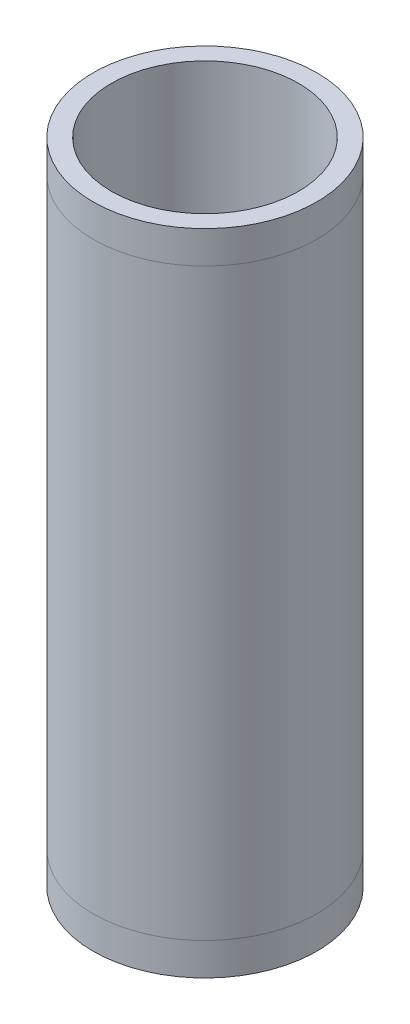
ISO-10303-21;
HEADER;
FILE_DESCRIPTION(('STEP AP214'),'2;1');
FILE_NAME('part.step','',(''),(''),'','','');
FILE_SCHEMA(('AUTOMOTIVE_DESIGN { 1 0 10303 214 1 1 1 1 }'));
ENDSEC;
DATA;
#1=APPLICATION_CONTEXT('core data for automotive mechanical design processes');
#2=APPLICATION_PROTOCOL_DEFINITION('international standard','automotive_design',2000,#1);
#3=PRODUCT_CONTEXT('',#1,'mechanical');
#4=PRODUCT('Part','Part','',(#3));
#5=PRODUCT_RELATED_PRODUCT_CATEGORY('part','',(#4));
#6=PRODUCT_DEFINITION_FORMATION('','',#4);
#7=PRODUCT_DEFINITION_CONTEXT('part definition',#1,'design');
#8=PRODUCT_DEFINITION('design','',#6,#7);
#9=PRODUCT_DEFINITION_SHAPE('','',#8);
#10=(LENGTH_UNIT() NAMED_UNIT(*) SI_UNIT(.MILLI.,.METRE.));
#11=(NAMED_UNIT(*) PLANE_ANGLE_UNIT() SI_UNIT($,.RADIAN.));
#12=(NAMED_UNIT(*) SI_UNIT($,.STERADIAN.) SOLID_ANGLE_UNIT());
#13=UNCERTAINTY_MEASURE_WITH_UNIT(LENGTH_MEASURE(1.E-05),#10,'distance_accuracy_value','');
#14=(GEOMETRIC_REPRESENTATION_CONTEXT(3) GLOBAL_UNCERTAINTY_ASSIGNED_CONTEXT((#13)) GLOBAL_UNIT_ASSIGNED_CONTEXT((#10,
#11,#12)) REPRESENTATION_CONTEXT('',''));
#15=CARTESIAN_POINT('',(0.,0.,0.));
#16=DIRECTION('',(0.,0.,1.));
#17=DIRECTION('',(1.,0.,0.));
#18=AXIS2_PLACEMENT_3D('',#15,#16,#17);
#19=CARTESIAN_POINT('',(0.,140.,0.));
#20=DIRECTION('',(0.,-1.,0.));
#21=DIRECTION('',(0.,0.,-1.));
#22=AXIS2_PLACEMENT_3D('',#19,#20,#21);
#23=CYLINDRICAL_SURFACE('',#22,24.13);
#24=CARTESIAN_POINT('',(0.,140.,0.));
#25=DIRECTION('',(0.,1.,0.));
#26=DIRECTION('',(0.,0.,1.));
#27=AXIS2_PLACEMENT_3D('',#24,#25,#26);
#28=CIRCLE('',#27,24.13);
#29=CARTESIAN_POINT('',(0.,140.,24.13));
#30=VERTEX_POINT('',#29);
#31=EDGE_CURVE('E58',#30,#30,#28,.T.);
#32=ORIENTED_EDGE('',*,*,#31,.F.);
#33=EDGE_LOOP('',(#32));
#34=FACE_BOUND('',#33,.T.);
#35=CARTESIAN_POINT('',(0.,133.,0.));
#36=DIRECTION('',(0.,1.,0.));
#37=DIRECTION('',(0.,0.,1.));
#38=AXIS2_PLACEMENT_3D('',#35,#36,#37);
#39=CIRCLE('',#38,24.13);
#40=CARTESIAN_POINT('',(0.,133.,24.13));
#41=VERTEX_POINT('',#40);
#42=EDGE_CURVE('E11',#41,#41,#39,.T.);
#43=ORIENTED_EDGE('',*,*,#42,.T.);
#44=EDGE_LOOP('',(#43));
#45=FACE_BOUND('',#44,.T.);
#46=ADVANCED_FACE('F47',(#34,#45),#23,.T.);
#47=ORIENTED_EDGE('',*,*,#42,.F.);
#48=EDGE_LOOP('',(#47));
#49=FACE_BOUND('',#48,.T.);
#50=CARTESIAN_POINT('',(0.,7.00000000000001,0.));
#51=DIRECTION('',(0.,1.,0.));
#52=DIRECTION('',(0.,0.,1.));
#53=AXIS2_PLACEMENT_3D('',#50,#51,#52);
#54=CIRCLE('',#53,24.13);
#55=CARTESIAN_POINT('',(0.,7.00000000000001,24.13));
#56=VERTEX_POINT('',#55);
#57=EDGE_CURVE('E54',#56,#56,#54,.T.);
#58=ORIENTED_EDGE('',*,*,#57,.T.);
#59=EDGE_LOOP('',(#58));
#60=FACE_BOUND('',#59,.T.);
#61=ADVANCED_FACE('F80',(#49,#60),#23,.T.);
#62=CARTESIAN_POINT('',(0.,140.,0.));
#63=DIRECTION('',(0.,1.,0.));
#64=DIRECTION('',(0.,0.,1.));
#65=AXIS2_PLACEMENT_3D('',#62,#63,#64);
#66=PLANE('',#65);
#67=ORIENTED_EDGE('',*,*,#31,.T.);
#68=EDGE_LOOP('',(#67));
#69=FACE_BOUND('',#68,.T.);
#70=CARTESIAN_POINT('',(0.,140.,0.));
#71=DIRECTION('',(0.,1.,0.));
#72=DIRECTION('',(0.,0.,1.));
#73=AXIS2_PLACEMENT_3D('',#70,#71,#72);
#74=CIRCLE('',#73,20.193);
#75=CARTESIAN_POINT('',(0.,140.,20.193));
#76=VERTEX_POINT('',#75);
#77=EDGE_CURVE('E66',#76,#76,#74,.T.);
#78=ORIENTED_EDGE('',*,*,#77,.F.);
#79=EDGE_LOOP('',(#78));
#80=FACE_BOUND('',#79,.T.);
#81=ADVANCED_FACE('F77',(#69,#80),#66,.T.);
#82=CARTESIAN_POINT('',(0.,0.,0.));
#83=DIRECTION('',(0.,1.,0.));
#84=DIRECTION('',(0.,0.,1.));
#85=AXIS2_PLACEMENT_3D('',#82,#83,#84);
#86=PLANE('',#85);
#87=CARTESIAN_POINT('',(0.,0.,0.));
#88=DIRECTION('',(0.,1.,0.));
#89=DIRECTION('',(0.,0.,1.));
#90=AXIS2_PLACEMENT_3D('',#87,#88,#89);
#91=CIRCLE('',#90,24.13);
#92=CARTESIAN_POINT('',(0.,0.,24.13));
#93=VERTEX_POINT('',#92);
#94=EDGE_CURVE('E62',#93,#93,#91,.T.);
#95=ORIENTED_EDGE('',*,*,#94,.F.);
#96=EDGE_LOOP('',(#95));
#97=FACE_BOUND('',#96,.T.);
#98=CARTESIAN_POINT('',(0.,0.,0.));
#99=DIRECTION('',(0.,1.,0.));
#100=DIRECTION('',(0.,0.,1.));
#101=AXIS2_PLACEMENT_3D('',#98,#99,#100);
#102=CIRCLE('',#101,20.193);
#103=CARTESIAN_POINT('',(0.,0.,20.193));
#104=VERTEX_POINT('',#103);
#105=EDGE_CURVE('E68',#104,#104,#102,.T.);
#106=ORIENTED_EDGE('',*,*,#105,.T.);
#107=EDGE_LOOP('',(#106));
#108=FACE_BOUND('',#107,.T.);
#109=ADVANCED_FACE('F79',(#97,#108),#86,.F.);
#110=ORIENTED_EDGE('',*,*,#57,.F.);
#111=EDGE_LOOP('',(#110));
#112=FACE_BOUND('',#111,.T.);
#113=ORIENTED_EDGE('',*,*,#94,.T.);
#114=EDGE_LOOP('',(#113));
#115=FACE_BOUND('',#114,.T.);
#116=ADVANCED_FACE('F49',(#112,#115),#23,.T.);
#117=CARTESIAN_POINT('',(0.,140.,0.));
#118=DIRECTION('',(0.,-1.,0.));
#119=DIRECTION('',(0.,0.,-1.));
#120=AXIS2_PLACEMENT_3D('',#117,#118,#119);
#121=CYLINDRICAL_SURFACE('',#120,20.193);
#122=ORIENTED_EDGE('',*,*,#77,.T.);
#123=EDGE_LOOP('',(#122));
#124=FACE_BOUND('',#123,.T.);
#125=ORIENTED_EDGE('',*,*,#105,.F.);
#126=EDGE_LOOP('',(#125));
#127=FACE_BOUND('',#126,.T.);
#128=ADVANCED_FACE('F74',(#124,#127),#121,.F.);
#129=CLOSED_SHELL('',(#46,#61,#81,#109,#116,#128));
#130=MANIFOLD_SOLID_BREP('B2',#129);
#131=ADVANCED_BREP_SHAPE_REPRESENTATION('',(#18,#130),#14);
#132=SHAPE_DEFINITION_REPRESENTATION(#9,#131);
ENDSEC;
END-ISO-10303-21;
